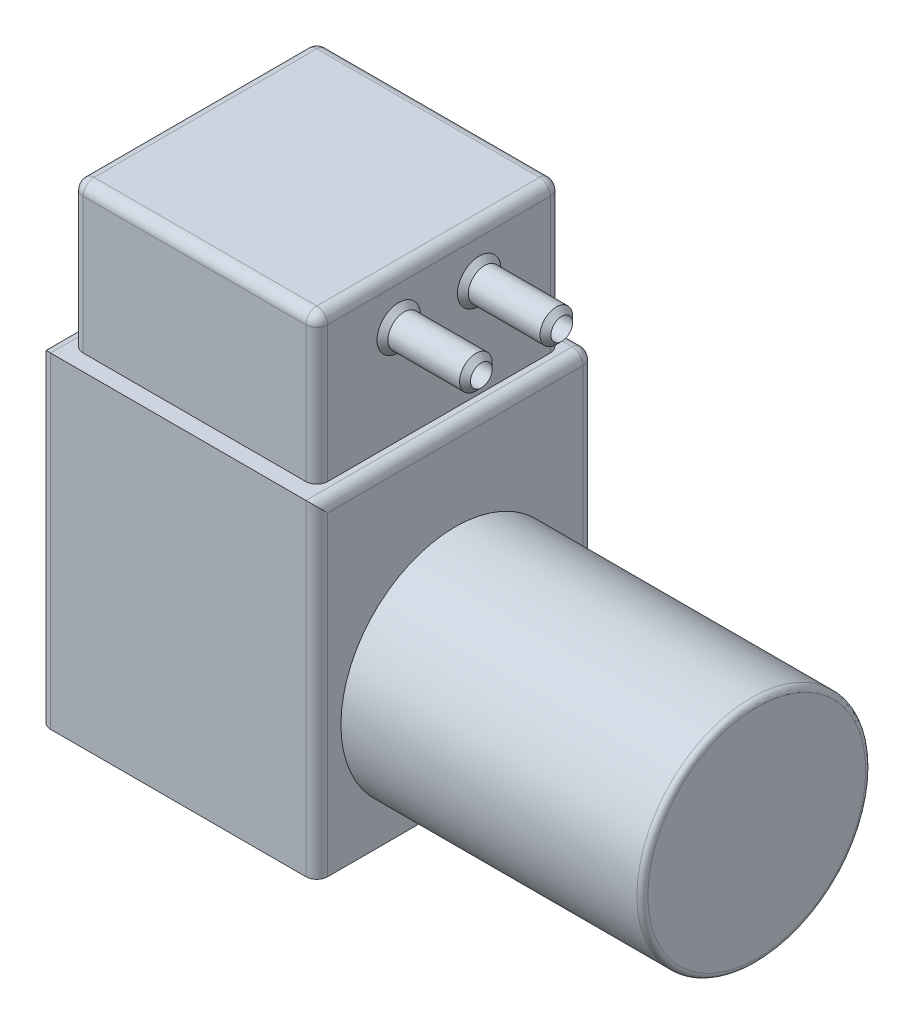
ISO-10303-21;
HEADER;
FILE_DESCRIPTION(('STEP AP214'),'2;1');
FILE_NAME('part.step','',(''),(''),'','','');
FILE_SCHEMA(('AUTOMOTIVE_DESIGN { 1 0 10303 214 1 1 1 1 }'));
ENDSEC;
DATA;
#1=APPLICATION_CONTEXT('core data for automotive mechanical design processes');
#2=APPLICATION_PROTOCOL_DEFINITION('international standard','automotive_design',2000,#1);
#3=PRODUCT_CONTEXT('',#1,'mechanical');
#4=PRODUCT('Part','Part','',(#3));
#5=PRODUCT_RELATED_PRODUCT_CATEGORY('part','',(#4));
#6=PRODUCT_DEFINITION_FORMATION('','',#4);
#7=PRODUCT_DEFINITION_CONTEXT('part definition',#1,'design');
#8=PRODUCT_DEFINITION('design','',#6,#7);
#9=PRODUCT_DEFINITION_SHAPE('','',#8);
#10=(LENGTH_UNIT() NAMED_UNIT(*) SI_UNIT(.MILLI.,.METRE.));
#11=(NAMED_UNIT(*) PLANE_ANGLE_UNIT() SI_UNIT($,.RADIAN.));
#12=(NAMED_UNIT(*) SI_UNIT($,.STERADIAN.) SOLID_ANGLE_UNIT());
#13=UNCERTAINTY_MEASURE_WITH_UNIT(LENGTH_MEASURE(1.E-05),#10,'distance_accuracy_value','');
#14=(GEOMETRIC_REPRESENTATION_CONTEXT(3) GLOBAL_UNCERTAINTY_ASSIGNED_CONTEXT((#13)) GLOBAL_UNIT_ASSIGNED_CONTEXT((#10,
#11,#12)) REPRESENTATION_CONTEXT('',''));
#15=CARTESIAN_POINT('',(0.,0.,0.));
#16=DIRECTION('',(0.,0.,1.));
#17=DIRECTION('',(1.,0.,0.));
#18=AXIS2_PLACEMENT_3D('',#15,#16,#17);
#19=CARTESIAN_POINT('',(48.,87.,-48.));
#20=DIRECTION('',(-1.,0.,0.));
#21=DIRECTION('',(0.,0.,1.));
#22=AXIS2_PLACEMENT_3D('',#19,#20,#21);
#23=PLANE('',#22);
#24=CARTESIAN_POINT('',(48.,78.,-18.1));
#25=DIRECTION('',(-1.,0.,0.));
#26=DIRECTION('',(0.,0.,1.));
#27=AXIS2_PLACEMENT_3D('',#24,#25,#26);
#28=CIRCLE('',#27,4.00000000000001);
#29=CARTESIAN_POINT('',(48.,78.,-14.1));
#30=VERTEX_POINT('',#29);
#31=EDGE_CURVE('E223',#30,#30,#28,.F.);
#32=ORIENTED_EDGE('',*,*,#31,.F.);
#33=EDGE_LOOP('',(#32));
#34=FACE_BOUND('',#33,.T.);
#35=DIRECTION('',(0.,0.,-1.));
#36=VECTOR('',#35,1.);
#37=CARTESIAN_POINT('',(48.,60.,-48.));
#38=LINE('',#37,#36);
#39=CARTESIAN_POINT('',(48.,60.,-5.00000000000001));
#40=VERTEX_POINT('',#39);
#41=CARTESIAN_POINT('',(48.,60.,-46.));
#42=VERTEX_POINT('',#41);
#43=EDGE_CURVE('E194',#40,#42,#38,.T.);
#44=ORIENTED_EDGE('',*,*,#43,.T.);
#45=DIRECTION('',(0.,-1.,0.));
#46=VECTOR('',#45,1.);
#47=CARTESIAN_POINT('',(48.,87.,-46.));
#48=LINE('',#47,#46);
#49=CARTESIAN_POINT('',(48.,85.,-46.));
#50=VERTEX_POINT('',#49);
#51=EDGE_CURVE('E257',#42,#50,#48,.F.);
#52=ORIENTED_EDGE('',*,*,#51,.T.);
#53=DIRECTION('',(0.,0.,-1.));
#54=VECTOR('',#53,1.);
#55=CARTESIAN_POINT('',(48.,85.,-3.));
#56=LINE('',#55,#54);
#57=CARTESIAN_POINT('',(48.,85.,-5.));
#58=VERTEX_POINT('',#57);
#59=EDGE_CURVE('E255',#50,#58,#56,.F.);
#60=ORIENTED_EDGE('',*,*,#59,.T.);
#61=DIRECTION('',(0.,-1.,0.));
#62=VECTOR('',#61,1.);
#63=CARTESIAN_POINT('',(48.,87.,-5.));
#64=LINE('',#63,#62);
#65=EDGE_CURVE('E253',#58,#40,#64,.T.);
#66=ORIENTED_EDGE('',*,*,#65,.T.);
#67=EDGE_LOOP('',(#44,#52,#60,#66));
#68=FACE_BOUND('',#67,.T.);
#69=CARTESIAN_POINT('',(48.,78.,-32.9));
#70=DIRECTION('',(-1.,0.,0.));
#71=DIRECTION('',(0.,0.,1.));
#72=AXIS2_PLACEMENT_3D('',#69,#70,#71);
#73=CIRCLE('',#72,4.00000000000001);
#74=CARTESIAN_POINT('',(48.,78.,-28.9));
#75=VERTEX_POINT('',#74);
#76=EDGE_CURVE('E226',#75,#75,#73,.F.);
#77=ORIENTED_EDGE('',*,*,#76,.F.);
#78=EDGE_LOOP('',(#77));
#79=FACE_BOUND('',#78,.T.);
#80=ADVANCED_FACE('F35',(#34,#68,#79),#23,.F.);
#81=CARTESIAN_POINT('',(51.,60.,0.));
#82=DIRECTION('',(-1.,0.,0.));
#83=DIRECTION('',(0.,0.,1.));
#84=AXIS2_PLACEMENT_3D('',#81,#82,#83);
#85=PLANE('',#84);
#86=DIRECTION('',(0.,0.,-1.));
#87=VECTOR('',#86,1.);
#88=CARTESIAN_POINT('',(51.,58.,0.));
#89=LINE('',#88,#87);
#90=CARTESIAN_POINT('',(51.,58.,-49.));
#91=VERTEX_POINT('',#90);
#92=CARTESIAN_POINT('',(51.,58.,-2.));
#93=VERTEX_POINT('',#92);
#94=EDGE_CURVE('E271',#91,#93,#89,.F.);
#95=ORIENTED_EDGE('',*,*,#94,.T.);
#96=DIRECTION('',(0.,-1.,0.));
#97=VECTOR('',#96,1.);
#98=CARTESIAN_POINT('',(51.,60.,-2.));
#99=LINE('',#98,#97);
#100=CARTESIAN_POINT('',(51.,0.,-2.));
#101=VERTEX_POINT('',#100);
#102=EDGE_CURVE('E312',#93,#101,#99,.T.);
#103=ORIENTED_EDGE('',*,*,#102,.T.);
#104=DIRECTION('',(0.,0.,-1.));
#105=VECTOR('',#104,1.);
#106=CARTESIAN_POINT('',(51.,0.,0.));
#107=LINE('',#106,#105);
#108=CARTESIAN_POINT('',(51.,0.,-49.));
#109=VERTEX_POINT('',#108);
#110=EDGE_CURVE('E217',#101,#109,#107,.T.);
#111=ORIENTED_EDGE('',*,*,#110,.T.);
#112=DIRECTION('',(0.,-1.,0.));
#113=VECTOR('',#112,1.);
#114=CARTESIAN_POINT('',(51.,60.,-49.));
#115=LINE('',#114,#113);
#116=EDGE_CURVE('E310',#109,#91,#115,.F.);
#117=ORIENTED_EDGE('',*,*,#116,.T.);
#118=EDGE_LOOP('',(#95,#103,#111,#117));
#119=FACE_BOUND('',#118,.T.);
#120=CARTESIAN_POINT('',(51.,23.,-25.5));
#121=DIRECTION('',(-1.,0.,0.));
#122=DIRECTION('',(0.,0.,1.));
#123=AXIS2_PLACEMENT_3D('',#120,#121,#122);
#124=CIRCLE('',#123,21.05);
#125=CARTESIAN_POINT('',(51.,23.,-4.45000000000001));
#126=VERTEX_POINT('',#125);
#127=EDGE_CURVE('E210',#126,#126,#124,.F.);
#128=ORIENTED_EDGE('',*,*,#127,.F.);
#129=EDGE_LOOP('',(#128));
#130=FACE_BOUND('',#129,.T.);
#131=ADVANCED_FACE('F381',(#119,#130),#85,.F.);
#132=CARTESIAN_POINT('',(0.,60.,-51.));
#133=DIRECTION('',(0.,-1.,0.));
#134=DIRECTION('',(0.,0.,-1.));
#135=AXIS2_PLACEMENT_3D('',#132,#133,#134);
#136=PLANE('',#135);
#137=DIRECTION('',(-1.,0.,0.));
#138=VECTOR('',#137,1.);
#139=CARTESIAN_POINT('',(0.,60.,-49.));
#140=LINE('',#139,#138);
#141=CARTESIAN_POINT('',(49.,60.,-49.));
#142=VERTEX_POINT('',#141);
#143=CARTESIAN_POINT('',(2.,60.,-49.));
#144=VERTEX_POINT('',#143);
#145=EDGE_CURVE('E335',#142,#144,#140,.T.);
#146=ORIENTED_EDGE('',*,*,#145,.T.);
#147=DIRECTION('',(0.,0.,1.));
#148=VECTOR('',#147,1.);
#149=CARTESIAN_POINT('',(2.,60.,-51.));
#150=LINE('',#149,#148);
#151=CARTESIAN_POINT('',(2.,60.,0.));
#152=VERTEX_POINT('',#151);
#153=EDGE_CURVE('E337',#144,#152,#150,.T.);
#154=ORIENTED_EDGE('',*,*,#153,.T.);
#155=DIRECTION('',(1.,0.,0.));
#156=VECTOR('',#155,1.);
#157=CARTESIAN_POINT('',(0.,60.,0.));
#158=LINE('',#157,#156);
#159=CARTESIAN_POINT('',(49.,60.,0.));
#160=VERTEX_POINT('',#159);
#161=EDGE_CURVE('E207',#152,#160,#158,.T.);
#162=ORIENTED_EDGE('',*,*,#161,.T.);
#163=DIRECTION('',(0.,0.,-1.));
#164=VECTOR('',#163,1.);
#165=CARTESIAN_POINT('',(49.,60.,-51.));
#166=LINE('',#165,#164);
#167=EDGE_CURVE('E333',#160,#142,#166,.T.);
#168=ORIENTED_EDGE('',*,*,#167,.T.);
#169=EDGE_LOOP('',(#146,#154,#162,#168));
#170=FACE_BOUND('',#169,.T.);
#171=DIRECTION('',(0.,0.,1.));
#172=VECTOR('',#171,1.);
#173=CARTESIAN_POINT('',(3.,60.,-48.));
#174=LINE('',#173,#172);
#175=CARTESIAN_POINT('',(3.,60.,-46.));
#176=VERTEX_POINT('',#175);
#177=CARTESIAN_POINT('',(3.00000000000001,60.,-5.00000000000001));
#178=VERTEX_POINT('',#177);
#179=EDGE_CURVE('E195',#176,#178,#174,.T.);
#180=ORIENTED_EDGE('',*,*,#179,.F.);
#181=CARTESIAN_POINT('',(5.,60.,-46.));
#182=DIRECTION('',(0.,-1.,0.));
#183=DIRECTION('',(0.,0.,-1.));
#184=AXIS2_PLACEMENT_3D('',#181,#182,#183);
#185=CIRCLE('',#184,2.);
#186=CARTESIAN_POINT('',(5.,60.,-48.));
#187=VERTEX_POINT('',#186);
#188=EDGE_CURVE('E176',#176,#187,#185,.T.);
#189=ORIENTED_EDGE('',*,*,#188,.T.);
#190=DIRECTION('',(-1.,0.,0.));
#191=VECTOR('',#190,1.);
#192=CARTESIAN_POINT('',(3.,60.,-48.));
#193=LINE('',#192,#191);
#194=CARTESIAN_POINT('',(46.,60.,-48.));
#195=VERTEX_POINT('',#194);
#196=EDGE_CURVE('E198',#195,#187,#193,.T.);
#197=ORIENTED_EDGE('',*,*,#196,.F.);
#198=CARTESIAN_POINT('',(46.,60.,-46.));
#199=DIRECTION('',(0.,-1.,0.));
#200=DIRECTION('',(0.,0.,-1.));
#201=AXIS2_PLACEMENT_3D('',#198,#199,#200);
#202=CIRCLE('',#201,2.);
#203=EDGE_CURVE('E268',#195,#42,#202,.T.);
#204=ORIENTED_EDGE('',*,*,#203,.T.);
#205=ORIENTED_EDGE('',*,*,#43,.F.);
#206=CARTESIAN_POINT('',(46.,60.,-5.));
#207=DIRECTION('',(0.,-1.,0.));
#208=DIRECTION('',(0.,0.,-1.));
#209=AXIS2_PLACEMENT_3D('',#206,#207,#208);
#210=CIRCLE('',#209,2.);
#211=CARTESIAN_POINT('',(46.,60.,-3.));
#212=VERTEX_POINT('',#211);
#213=EDGE_CURVE('E193',#40,#212,#210,.T.);
#214=ORIENTED_EDGE('',*,*,#213,.T.);
#215=DIRECTION('',(1.,0.,0.));
#216=VECTOR('',#215,1.);
#217=CARTESIAN_POINT('',(3.00000000000001,60.,-3.));
#218=LINE('',#217,#216);
#219=CARTESIAN_POINT('',(5.,60.,-3.));
#220=VERTEX_POINT('',#219);
#221=EDGE_CURVE('E182',#220,#212,#218,.T.);
#222=ORIENTED_EDGE('',*,*,#221,.F.);
#223=CARTESIAN_POINT('',(5.00000000000001,60.,-5.));
#224=DIRECTION('',(0.,-1.,0.));
#225=DIRECTION('',(0.,0.,-1.));
#226=AXIS2_PLACEMENT_3D('',#223,#224,#225);
#227=CIRCLE('',#226,2.);
#228=EDGE_CURVE('E166',#220,#178,#227,.T.);
#229=ORIENTED_EDGE('',*,*,#228,.T.);
#230=EDGE_LOOP('',(#180,#189,#197,#204,#205,#214,#222,#229));
#231=FACE_BOUND('',#230,.T.);
#232=ADVANCED_FACE('F190',(#170,#231),#136,.F.);
#233=CARTESIAN_POINT('',(0.,60.,0.));
#234=DIRECTION('',(1.,0.,0.));
#235=DIRECTION('',(0.,0.,-1.));
#236=AXIS2_PLACEMENT_3D('',#233,#234,#235);
#237=PLANE('',#236);
#238=DIRECTION('',(0.,0.,1.));
#239=VECTOR('',#238,1.);
#240=CARTESIAN_POINT('',(0.,0.,0.));
#241=LINE('',#240,#239);
#242=CARTESIAN_POINT('',(0.,0.,-49.));
#243=VERTEX_POINT('',#242);
#244=CARTESIAN_POINT('',(0.,0.,-2.));
#245=VERTEX_POINT('',#244);
#246=EDGE_CURVE('E206',#243,#245,#241,.T.);
#247=ORIENTED_EDGE('',*,*,#246,.T.);
#248=DIRECTION('',(0.,-1.,0.));
#249=VECTOR('',#248,1.);
#250=CARTESIAN_POINT('',(0.,60.,-2.));
#251=LINE('',#250,#249);
#252=CARTESIAN_POINT('',(0.,58.,-2.));
#253=VERTEX_POINT('',#252);
#254=EDGE_CURVE('E331',#245,#253,#251,.F.);
#255=ORIENTED_EDGE('',*,*,#254,.T.);
#256=DIRECTION('',(0.,0.,1.));
#257=VECTOR('',#256,1.);
#258=CARTESIAN_POINT('',(0.,58.,0.));
#259=LINE('',#258,#257);
#260=CARTESIAN_POINT('',(0.,58.,-49.));
#261=VERTEX_POINT('',#260);
#262=EDGE_CURVE('E329',#253,#261,#259,.F.);
#263=ORIENTED_EDGE('',*,*,#262,.T.);
#264=DIRECTION('',(0.,-1.,0.));
#265=VECTOR('',#264,1.);
#266=CARTESIAN_POINT('',(0.,60.,-49.));
#267=LINE('',#266,#265);
#268=EDGE_CURVE('E327',#261,#243,#267,.T.);
#269=ORIENTED_EDGE('',*,*,#268,.T.);
#270=EDGE_LOOP('',(#247,#255,#263,#269));
#271=FACE_BOUND('',#270,.T.);
#272=ADVANCED_FACE('F404',(#271),#237,.F.);
#273=CARTESIAN_POINT('',(0.,60.,0.));
#274=DIRECTION('',(0.,0.,-1.));
#275=DIRECTION('',(-1.,0.,0.));
#276=AXIS2_PLACEMENT_3D('',#273,#274,#275);
#277=PLANE('',#276);
#278=DIRECTION('',(1.,0.,0.));
#279=VECTOR('',#278,1.);
#280=CARTESIAN_POINT('',(0.,0.,0.));
#281=LINE('',#280,#279);
#282=CARTESIAN_POINT('',(2.,0.,0.));
#283=VERTEX_POINT('',#282);
#284=CARTESIAN_POINT('',(49.,0.,0.));
#285=VERTEX_POINT('',#284);
#286=EDGE_CURVE('E214',#283,#285,#281,.T.);
#287=ORIENTED_EDGE('',*,*,#286,.T.);
#288=DIRECTION('',(0.,-1.,0.));
#289=VECTOR('',#288,1.);
#290=CARTESIAN_POINT('',(49.,60.,0.));
#291=LINE('',#290,#289);
#292=EDGE_CURVE('E325',#285,#160,#291,.F.);
#293=ORIENTED_EDGE('',*,*,#292,.T.);
#294=ORIENTED_EDGE('',*,*,#161,.F.);
#295=DIRECTION('',(0.,-1.,0.));
#296=VECTOR('',#295,1.);
#297=CARTESIAN_POINT('',(2.,60.,0.));
#298=LINE('',#297,#296);
#299=EDGE_CURVE('E323',#152,#283,#298,.T.);
#300=ORIENTED_EDGE('',*,*,#299,.T.);
#301=EDGE_LOOP('',(#287,#293,#294,#300));
#302=FACE_BOUND('',#301,.T.);
#303=ADVANCED_FACE('F411',(#302),#277,.F.);
#304=CARTESIAN_POINT('',(0.,60.,-51.));
#305=DIRECTION('',(0.,0.,1.));
#306=DIRECTION('',(1.,0.,0.));
#307=AXIS2_PLACEMENT_3D('',#304,#305,#306);
#308=PLANE('',#307);
#309=DIRECTION('',(-1.,0.,0.));
#310=VECTOR('',#309,1.);
#311=CARTESIAN_POINT('',(0.,0.,-51.));
#312=LINE('',#311,#310);
#313=CARTESIAN_POINT('',(49.,0.,-51.));
#314=VERTEX_POINT('',#313);
#315=CARTESIAN_POINT('',(2.,0.,-51.));
#316=VERTEX_POINT('',#315);
#317=EDGE_CURVE('E211',#314,#316,#312,.T.);
#318=ORIENTED_EDGE('',*,*,#317,.T.);
#319=DIRECTION('',(0.,-1.,0.));
#320=VECTOR('',#319,1.);
#321=CARTESIAN_POINT('',(2.,60.,-51.));
#322=LINE('',#321,#320);
#323=CARTESIAN_POINT('',(2.,58.,-51.));
#324=VERTEX_POINT('',#323);
#325=EDGE_CURVE('E50',#316,#324,#322,.F.);
#326=ORIENTED_EDGE('',*,*,#325,.T.);
#327=DIRECTION('',(-1.,0.,0.));
#328=VECTOR('',#327,1.);
#329=CARTESIAN_POINT('',(0.,58.,-51.));
#330=LINE('',#329,#328);
#331=CARTESIAN_POINT('',(49.,58.,-51.));
#332=VERTEX_POINT('',#331);
#333=EDGE_CURVE('E55',#324,#332,#330,.F.);
#334=ORIENTED_EDGE('',*,*,#333,.T.);
#335=DIRECTION('',(0.,-1.,0.));
#336=VECTOR('',#335,1.);
#337=CARTESIAN_POINT('',(49.,60.,-51.));
#338=LINE('',#337,#336);
#339=EDGE_CURVE('E339',#332,#314,#338,.T.);
#340=ORIENTED_EDGE('',*,*,#339,.T.);
#341=EDGE_LOOP('',(#318,#326,#334,#340));
#342=FACE_BOUND('',#341,.T.);
#343=ADVANCED_FACE('F408',(#342),#308,.F.);
#344=CARTESIAN_POINT('',(0.,0.,-51.));
#345=DIRECTION('',(0.,-1.,0.));
#346=DIRECTION('',(0.,0.,-1.));
#347=AXIS2_PLACEMENT_3D('',#344,#345,#346);
#348=PLANE('',#347);
#349=ORIENTED_EDGE('',*,*,#110,.F.);
#350=CARTESIAN_POINT('',(49.,0.,-2.));
#351=DIRECTION('',(0.,-1.,0.));
#352=DIRECTION('',(0.,0.,-1.));
#353=AXIS2_PLACEMENT_3D('',#350,#351,#352);
#354=CIRCLE('',#353,2.);
#355=EDGE_CURVE('E321',#101,#285,#354,.T.);
#356=ORIENTED_EDGE('',*,*,#355,.T.);
#357=ORIENTED_EDGE('',*,*,#286,.F.);
#358=CARTESIAN_POINT('',(2.,0.,-2.));
#359=DIRECTION('',(0.,-1.,0.));
#360=DIRECTION('',(0.,0.,-1.));
#361=AXIS2_PLACEMENT_3D('',#358,#359,#360);
#362=CIRCLE('',#361,2.);
#363=EDGE_CURVE('E319',#283,#245,#362,.T.);
#364=ORIENTED_EDGE('',*,*,#363,.T.);
#365=ORIENTED_EDGE('',*,*,#246,.F.);
#366=CARTESIAN_POINT('',(2.,0.,-49.));
#367=DIRECTION('',(0.,-1.,0.));
#368=DIRECTION('',(0.,0.,-1.));
#369=AXIS2_PLACEMENT_3D('',#366,#367,#368);
#370=CIRCLE('',#369,2.);
#371=EDGE_CURVE('E317',#243,#316,#370,.T.);
#372=ORIENTED_EDGE('',*,*,#371,.T.);
#373=ORIENTED_EDGE('',*,*,#317,.F.);
#374=CARTESIAN_POINT('',(49.,0.,-49.));
#375=DIRECTION('',(0.,-1.,0.));
#376=DIRECTION('',(0.,0.,-1.));
#377=AXIS2_PLACEMENT_3D('',#374,#375,#376);
#378=CIRCLE('',#377,2.);
#379=EDGE_CURVE('E315',#314,#109,#378,.T.);
#380=ORIENTED_EDGE('',*,*,#379,.T.);
#381=EDGE_LOOP('',(#349,#356,#357,#364,#365,#372,#373,#380));
#382=FACE_BOUND('',#381,.T.);
#383=ADVANCED_FACE('F400',(#382),#348,.T.);
#384=CARTESIAN_POINT('',(3.,87.,-48.));
#385=DIRECTION('',(1.,0.,0.));
#386=DIRECTION('',(0.,0.,-1.));
#387=AXIS2_PLACEMENT_3D('',#384,#385,#386);
#388=PLANE('',#387);
#389=ORIENTED_EDGE('',*,*,#179,.T.);
#390=DIRECTION('',(0.,-1.,0.));
#391=VECTOR('',#390,1.);
#392=CARTESIAN_POINT('',(3.00000000000001,87.,-5.));
#393=LINE('',#392,#391);
#394=CARTESIAN_POINT('',(3.00000000000001,85.,-5.));
#395=VERTEX_POINT('',#394);
#396=EDGE_CURVE('E171',#178,#395,#393,.F.);
#397=ORIENTED_EDGE('',*,*,#396,.T.);
#398=DIRECTION('',(0.,0.,1.));
#399=VECTOR('',#398,1.);
#400=CARTESIAN_POINT('',(3.,85.,-48.));
#401=LINE('',#400,#399);
#402=CARTESIAN_POINT('',(3.,85.,-46.));
#403=VERTEX_POINT('',#402);
#404=EDGE_CURVE('E187',#395,#403,#401,.F.);
#405=ORIENTED_EDGE('',*,*,#404,.T.);
#406=DIRECTION('',(0.,-1.,0.));
#407=VECTOR('',#406,1.);
#408=CARTESIAN_POINT('',(3.,87.,-46.));
#409=LINE('',#408,#407);
#410=EDGE_CURVE('E244',#403,#176,#409,.T.);
#411=ORIENTED_EDGE('',*,*,#410,.T.);
#412=EDGE_LOOP('',(#389,#397,#405,#411));
#413=FACE_BOUND('',#412,.T.);
#414=ADVANCED_FACE('F397',(#413),#388,.F.);
#415=CARTESIAN_POINT('',(3.00000000000001,87.,-3.));
#416=DIRECTION('',(0.,0.,-1.));
#417=DIRECTION('',(-1.,0.,0.));
#418=AXIS2_PLACEMENT_3D('',#415,#416,#417);
#419=PLANE('',#418);
#420=DIRECTION('',(1.,0.,0.));
#421=VECTOR('',#420,1.);
#422=CARTESIAN_POINT('',(3.00000000000001,85.,-3.));
#423=LINE('',#422,#421);
#424=CARTESIAN_POINT('',(46.,85.,-3.));
#425=VERTEX_POINT('',#424);
#426=CARTESIAN_POINT('',(5.00000000000001,85.,-3.));
#427=VERTEX_POINT('',#426);
#428=EDGE_CURVE('E185',#425,#427,#423,.F.);
#429=ORIENTED_EDGE('',*,*,#428,.T.);
#430=DIRECTION('',(0.,-1.,0.));
#431=VECTOR('',#430,1.);
#432=CARTESIAN_POINT('',(5.00000000000001,87.,-3.));
#433=LINE('',#432,#431);
#434=EDGE_CURVE('E170',#427,#220,#433,.T.);
#435=ORIENTED_EDGE('',*,*,#434,.T.);
#436=ORIENTED_EDGE('',*,*,#221,.T.);
#437=DIRECTION('',(0.,-1.,0.));
#438=VECTOR('',#437,1.);
#439=CARTESIAN_POINT('',(46.,87.,-3.));
#440=LINE('',#439,#438);
#441=EDGE_CURVE('E188',#212,#425,#440,.F.);
#442=ORIENTED_EDGE('',*,*,#441,.T.);
#443=EDGE_LOOP('',(#429,#435,#436,#442));
#444=FACE_BOUND('',#443,.T.);
#445=ADVANCED_FACE('F181',(#444),#419,.F.);
#446=CARTESIAN_POINT('',(3.,87.,-48.));
#447=DIRECTION('',(0.,0.,1.));
#448=DIRECTION('',(1.,0.,0.));
#449=AXIS2_PLACEMENT_3D('',#446,#447,#448);
#450=PLANE('',#449);
#451=ORIENTED_EDGE('',*,*,#196,.T.);
#452=DIRECTION('',(0.,-1.,0.));
#453=VECTOR('',#452,1.);
#454=CARTESIAN_POINT('',(5.,87.,-48.));
#455=LINE('',#454,#453);
#456=CARTESIAN_POINT('',(5.,85.,-48.));
#457=VERTEX_POINT('',#456);
#458=EDGE_CURVE('E251',#187,#457,#455,.F.);
#459=ORIENTED_EDGE('',*,*,#458,.T.);
#460=DIRECTION('',(-1.,0.,0.));
#461=VECTOR('',#460,1.);
#462=CARTESIAN_POINT('',(48.,85.,-48.));
#463=LINE('',#462,#461);
#464=CARTESIAN_POINT('',(46.,85.,-48.));
#465=VERTEX_POINT('',#464);
#466=EDGE_CURVE('E247',#457,#465,#463,.F.);
#467=ORIENTED_EDGE('',*,*,#466,.T.);
#468=DIRECTION('',(0.,-1.,0.));
#469=VECTOR('',#468,1.);
#470=CARTESIAN_POINT('',(46.,87.,-48.));
#471=LINE('',#470,#469);
#472=EDGE_CURVE('E249',#465,#195,#471,.T.);
#473=ORIENTED_EDGE('',*,*,#472,.T.);
#474=EDGE_LOOP('',(#451,#459,#467,#473));
#475=FACE_BOUND('',#474,.T.);
#476=ADVANCED_FACE('F393',(#475),#450,.F.);
#477=CARTESIAN_POINT('',(3.00000000000001,87.,-3.));
#478=DIRECTION('',(0.,1.,0.));
#479=DIRECTION('',(0.,0.,1.));
#480=AXIS2_PLACEMENT_3D('',#477,#478,#479);
#481=PLANE('',#480);
#482=DIRECTION('',(0.,0.,-1.));
#483=VECTOR('',#482,1.);
#484=CARTESIAN_POINT('',(46.,87.,-48.));
#485=LINE('',#484,#483);
#486=CARTESIAN_POINT('',(46.,87.,-5.));
#487=VERTEX_POINT('',#486);
#488=CARTESIAN_POINT('',(46.,87.,-46.));
#489=VERTEX_POINT('',#488);
#490=EDGE_CURVE('E261',#487,#489,#485,.T.);
#491=ORIENTED_EDGE('',*,*,#490,.T.);
#492=DIRECTION('',(-1.,0.,0.));
#493=VECTOR('',#492,1.);
#494=CARTESIAN_POINT('',(3.,87.,-46.));
#495=LINE('',#494,#493);
#496=CARTESIAN_POINT('',(5.,87.,-46.));
#497=VERTEX_POINT('',#496);
#498=EDGE_CURVE('E177',#489,#497,#495,.T.);
#499=ORIENTED_EDGE('',*,*,#498,.T.);
#500=DIRECTION('',(0.,0.,1.));
#501=VECTOR('',#500,1.);
#502=CARTESIAN_POINT('',(5.00000000000001,87.,-3.));
#503=LINE('',#502,#501);
#504=CARTESIAN_POINT('',(5.00000000000001,87.,-5.));
#505=VERTEX_POINT('',#504);
#506=EDGE_CURVE('E263',#497,#505,#503,.T.);
#507=ORIENTED_EDGE('',*,*,#506,.T.);
#508=DIRECTION('',(1.,0.,0.));
#509=VECTOR('',#508,1.);
#510=CARTESIAN_POINT('',(48.,87.,-5.));
#511=LINE('',#510,#509);
#512=EDGE_CURVE('E259',#505,#487,#511,.T.);
#513=ORIENTED_EDGE('',*,*,#512,.T.);
#514=EDGE_LOOP('',(#491,#499,#507,#513));
#515=FACE_BOUND('',#514,.T.);
#516=ADVANCED_FACE('F544',(#515),#481,.T.);
#517=CARTESIAN_POINT('',(106.5,23.,-25.5));
#518=DIRECTION('',(-1.,0.,0.));
#519=DIRECTION('',(0.,0.,1.));
#520=AXIS2_PLACEMENT_3D('',#517,#518,#519);
#521=CYLINDRICAL_SURFACE('',#520,21.05);
#522=CARTESIAN_POINT('',(105.5,23.,-25.5));
#523=DIRECTION('',(1.,0.,0.));
#524=DIRECTION('',(0.,0.,-1.));
#525=AXIS2_PLACEMENT_3D('',#522,#523,#524);
#526=CIRCLE('',#525,21.05);
#527=CARTESIAN_POINT('',(105.5,23.,-46.55));
#528=VERTEX_POINT('',#527);
#529=EDGE_CURVE('E11',#528,#528,#526,.F.);
#530=ORIENTED_EDGE('',*,*,#529,.T.);
#531=EDGE_LOOP('',(#530));
#532=FACE_BOUND('',#531,.T.);
#533=ORIENTED_EDGE('',*,*,#127,.T.);
#534=EDGE_LOOP('',(#533));
#535=FACE_BOUND('',#534,.T.);
#536=ADVANCED_FACE('F542',(#532,#535),#521,.T.);
#537=CARTESIAN_POINT('',(106.5,23.,-25.5));
#538=DIRECTION('',(1.,0.,0.));
#539=DIRECTION('',(0.,0.,-1.));
#540=AXIS2_PLACEMENT_3D('',#537,#538,#539);
#541=PLANE('',#540);
#542=CARTESIAN_POINT('',(106.5,23.,-25.5));
#543=DIRECTION('',(1.,0.,0.));
#544=DIRECTION('',(0.,0.,-1.));
#545=AXIS2_PLACEMENT_3D('',#542,#543,#544);
#546=CIRCLE('',#545,20.05);
#547=CARTESIAN_POINT('',(106.5,23.,-45.55));
#548=VERTEX_POINT('',#547);
#549=EDGE_CURVE('E43',#548,#548,#546,.T.);
#550=ORIENTED_EDGE('',*,*,#549,.T.);
#551=EDGE_LOOP('',(#550));
#552=FACE_BOUND('',#551,.T.);
#553=ADVANCED_FACE('F368',(#552),#541,.T.);
#554=CARTESIAN_POINT('',(63.2,78.,-18.1));
#555=DIRECTION('',(-1.,0.,0.));
#556=DIRECTION('',(0.,0.,1.));
#557=AXIS2_PLACEMENT_3D('',#554,#555,#556);
#558=CYLINDRICAL_SURFACE('',#557,3.);
#559=CARTESIAN_POINT('',(62.2,78.,-18.1));
#560=DIRECTION('',(1.,0.,0.));
#561=DIRECTION('',(0.,0.,-1.));
#562=AXIS2_PLACEMENT_3D('',#559,#560,#561);
#563=CIRCLE('',#562,3.);
#564=CARTESIAN_POINT('',(62.2,78.,-21.1));
#565=VERTEX_POINT('',#564);
#566=EDGE_CURVE('E238',#565,#565,#563,.F.);
#567=ORIENTED_EDGE('',*,*,#566,.T.);
#568=EDGE_LOOP('',(#567));
#569=FACE_BOUND('',#568,.T.);
#570=CARTESIAN_POINT('',(49.,78.,-18.1));
#571=DIRECTION('',(1.,0.,0.));
#572=DIRECTION('',(0.,0.,-1.));
#573=AXIS2_PLACEMENT_3D('',#570,#571,#572);
#574=CIRCLE('',#573,3.);
#575=CARTESIAN_POINT('',(49.,78.,-21.1));
#576=VERTEX_POINT('',#575);
#577=EDGE_CURVE('E200',#576,#576,#574,.T.);
#578=ORIENTED_EDGE('',*,*,#577,.T.);
#579=EDGE_LOOP('',(#578));
#580=FACE_BOUND('',#579,.T.);
#581=ADVANCED_FACE('F551',(#569,#580),#558,.T.);
#582=CARTESIAN_POINT('',(63.2,78.,-18.1));
#583=DIRECTION('',(-1.,0.,0.));
#584=DIRECTION('',(0.,0.,1.));
#585=AXIS2_PLACEMENT_3D('',#582,#583,#584);
#586=CYLINDRICAL_SURFACE('',#585,2.);
#587=CARTESIAN_POINT('',(63.2,78.,-18.1));
#588=DIRECTION('',(1.,0.,0.));
#589=DIRECTION('',(0.,0.,-1.));
#590=AXIS2_PLACEMENT_3D('',#587,#588,#589);
#591=CIRCLE('',#590,2.);
#592=CARTESIAN_POINT('',(63.2,78.,-20.1));
#593=VERTEX_POINT('',#592);
#594=EDGE_CURVE('E586',#593,#593,#591,.T.);
#595=ORIENTED_EDGE('',*,*,#594,.T.);
#596=EDGE_LOOP('',(#595));
#597=FACE_BOUND('',#596,.T.);
#598=CARTESIAN_POINT('',(49.,78.,-18.1));
#599=DIRECTION('',(1.,0.,0.));
#600=DIRECTION('',(0.,0.,-1.));
#601=AXIS2_PLACEMENT_3D('',#598,#599,#600);
#602=CIRCLE('',#601,2.);
#603=CARTESIAN_POINT('',(49.,78.,-20.1));
#604=VERTEX_POINT('',#603);
#605=EDGE_CURVE('E229',#604,#604,#602,.F.);
#606=ORIENTED_EDGE('',*,*,#605,.T.);
#607=EDGE_LOOP('',(#606));
#608=FACE_BOUND('',#607,.T.);
#609=ADVANCED_FACE('F559',(#597,#608),#586,.F.);
#610=CARTESIAN_POINT('',(49.,78.,-18.1));
#611=DIRECTION('',(1.,0.,0.));
#612=DIRECTION('',(0.,0.,-1.));
#613=AXIS2_PLACEMENT_3D('',#610,#611,#612);
#614=PLANE('',#613);
#615=ORIENTED_EDGE('',*,*,#605,.F.);
#616=EDGE_LOOP('',(#615));
#617=FACE_BOUND('',#616,.T.);
#618=ADVANCED_FACE('F555',(#617),#614,.T.);
#619=CARTESIAN_POINT('',(63.2,78.,-32.9));
#620=DIRECTION('',(-1.,0.,0.));
#621=DIRECTION('',(0.,0.,1.));
#622=AXIS2_PLACEMENT_3D('',#619,#620,#621);
#623=CYLINDRICAL_SURFACE('',#622,3.);
#624=CARTESIAN_POINT('',(62.2,78.,-32.9));
#625=DIRECTION('',(1.,0.,0.));
#626=DIRECTION('',(0.,0.,-1.));
#627=AXIS2_PLACEMENT_3D('',#624,#625,#626);
#628=CIRCLE('',#627,3.);
#629=CARTESIAN_POINT('',(62.2,78.,-35.9));
#630=VERTEX_POINT('',#629);
#631=EDGE_CURVE('E235',#630,#630,#628,.F.);
#632=ORIENTED_EDGE('',*,*,#631,.T.);
#633=EDGE_LOOP('',(#632));
#634=FACE_BOUND('',#633,.T.);
#635=CARTESIAN_POINT('',(49.,78.,-32.9));
#636=DIRECTION('',(1.,0.,0.));
#637=DIRECTION('',(0.,0.,-1.));
#638=AXIS2_PLACEMENT_3D('',#635,#636,#637);
#639=CIRCLE('',#638,3.);
#640=CARTESIAN_POINT('',(49.,78.,-35.9));
#641=VERTEX_POINT('',#640);
#642=EDGE_CURVE('E583',#641,#641,#639,.T.);
#643=ORIENTED_EDGE('',*,*,#642,.T.);
#644=EDGE_LOOP('',(#643));
#645=FACE_BOUND('',#644,.T.);
#646=ADVANCED_FACE('F558',(#634,#645),#623,.T.);
#647=CARTESIAN_POINT('',(63.2,78.,-32.9));
#648=DIRECTION('',(-1.,0.,0.));
#649=DIRECTION('',(0.,0.,1.));
#650=AXIS2_PLACEMENT_3D('',#647,#648,#649);
#651=CYLINDRICAL_SURFACE('',#650,2.);
#652=CARTESIAN_POINT('',(63.2,78.,-32.9));
#653=DIRECTION('',(1.,0.,0.));
#654=DIRECTION('',(0.,0.,-1.));
#655=AXIS2_PLACEMENT_3D('',#652,#653,#654);
#656=CIRCLE('',#655,2.);
#657=CARTESIAN_POINT('',(63.2,78.,-34.9));
#658=VERTEX_POINT('',#657);
#659=EDGE_CURVE('E308',#658,#658,#656,.T.);
#660=ORIENTED_EDGE('',*,*,#659,.T.);
#661=EDGE_LOOP('',(#660));
#662=FACE_BOUND('',#661,.T.);
#663=CARTESIAN_POINT('',(49.,78.,-32.9));
#664=DIRECTION('',(1.,0.,0.));
#665=DIRECTION('',(0.,0.,-1.));
#666=AXIS2_PLACEMENT_3D('',#663,#664,#665);
#667=CIRCLE('',#666,2.);
#668=CARTESIAN_POINT('',(49.,78.,-34.9));
#669=VERTEX_POINT('',#668);
#670=EDGE_CURVE('E232',#669,#669,#667,.F.);
#671=ORIENTED_EDGE('',*,*,#670,.T.);
#672=EDGE_LOOP('',(#671));
#673=FACE_BOUND('',#672,.T.);
#674=ADVANCED_FACE('F563',(#662,#673),#651,.F.);
#675=CARTESIAN_POINT('',(49.,78.,-32.9));
#676=DIRECTION('',(1.,0.,0.));
#677=DIRECTION('',(0.,0.,-1.));
#678=AXIS2_PLACEMENT_3D('',#675,#676,#677);
#679=PLANE('',#678);
#680=ORIENTED_EDGE('',*,*,#670,.F.);
#681=EDGE_LOOP('',(#680));
#682=FACE_BOUND('',#681,.T.);
#683=ADVANCED_FACE('F423',(#682),#679,.T.);
#684=CARTESIAN_POINT('',(63.2,78.,-32.9));
#685=DIRECTION('',(-1.,0.,0.));
#686=DIRECTION('',(0.,0.,1.));
#687=AXIS2_PLACEMENT_3D('',#684,#685,#686);
#688=CONICAL_SURFACE('',#687,1.99999999999997,0.785398163397444);
#689=ORIENTED_EDGE('',*,*,#631,.F.);
#690=EDGE_LOOP('',(#689));
#691=FACE_BOUND('',#690,.T.);
#692=ORIENTED_EDGE('',*,*,#659,.F.);
#693=EDGE_LOOP('',(#692));
#694=FACE_BOUND('',#693,.T.);
#695=ADVANCED_FACE('F419',(#691,#694),#688,.T.);
#696=CARTESIAN_POINT('',(49.,78.,-32.9));
#697=DIRECTION('',(-1.,0.,0.));
#698=DIRECTION('',(0.,0.,1.));
#699=AXIS2_PLACEMENT_3D('',#696,#697,#698);
#700=CONICAL_SURFACE('',#699,3.,0.78539816339745);
#701=ORIENTED_EDGE('',*,*,#76,.T.);
#702=EDGE_LOOP('',(#701));
#703=FACE_BOUND('',#702,.T.);
#704=ORIENTED_EDGE('',*,*,#642,.F.);
#705=EDGE_LOOP('',(#704));
#706=FACE_BOUND('',#705,.T.);
#707=ADVANCED_FACE('F422',(#703,#706),#700,.T.);
#708=CARTESIAN_POINT('',(63.2,78.,-18.1));
#709=DIRECTION('',(-1.,0.,0.));
#710=DIRECTION('',(0.,0.,1.));
#711=AXIS2_PLACEMENT_3D('',#708,#709,#710);
#712=CONICAL_SURFACE('',#711,1.99999999999997,0.785398163397443);
#713=ORIENTED_EDGE('',*,*,#566,.F.);
#714=EDGE_LOOP('',(#713));
#715=FACE_BOUND('',#714,.T.);
#716=ORIENTED_EDGE('',*,*,#594,.F.);
#717=EDGE_LOOP('',(#716));
#718=FACE_BOUND('',#717,.T.);
#719=ADVANCED_FACE('F427',(#715,#718),#712,.T.);
#720=CARTESIAN_POINT('',(49.,78.,-18.1));
#721=DIRECTION('',(-1.,0.,0.));
#722=DIRECTION('',(0.,0.,1.));
#723=AXIS2_PLACEMENT_3D('',#720,#721,#722);
#724=CONICAL_SURFACE('',#723,3.,0.785398163397447);
#725=ORIENTED_EDGE('',*,*,#31,.T.);
#726=EDGE_LOOP('',(#725));
#727=FACE_BOUND('',#726,.T.);
#728=ORIENTED_EDGE('',*,*,#577,.F.);
#729=EDGE_LOOP('',(#728));
#730=FACE_BOUND('',#729,.T.);
#731=ADVANCED_FACE('F431',(#727,#730),#724,.T.);
#732=CARTESIAN_POINT('',(46.,87.,-46.));
#733=DIRECTION('',(0.,-1.,0.));
#734=DIRECTION('',(0.,0.,-1.));
#735=AXIS2_PLACEMENT_3D('',#732,#733,#734);
#736=CYLINDRICAL_SURFACE('',#735,2.);
#737=CARTESIAN_POINT('',(46.,85.,-46.));
#738=DIRECTION('',(0.,1.,0.));
#739=DIRECTION('',(0.,0.,1.));
#740=AXIS2_PLACEMENT_3D('',#737,#738,#739);
#741=CIRCLE('',#740,2.);
#742=EDGE_CURVE('E305',#50,#465,#741,.T.);
#743=ORIENTED_EDGE('',*,*,#742,.F.);
#744=ORIENTED_EDGE('',*,*,#51,.F.);
#745=ORIENTED_EDGE('',*,*,#203,.F.);
#746=ORIENTED_EDGE('',*,*,#472,.F.);
#747=EDGE_LOOP('',(#743,#744,#745,#746));
#748=FACE_BOUND('',#747,.T.);
#749=ADVANCED_FACE('F435',(#748),#736,.T.);
#750=CARTESIAN_POINT('',(46.,85.,-46.));
#751=DIRECTION('',(0.,0.,1.));
#752=DIRECTION('',(1.,0.,0.));
#753=AXIS2_PLACEMENT_3D('',#750,#751,#752);
#754=SPHERICAL_SURFACE('',#753,2.);
#755=CARTESIAN_POINT('',(46.,85.,-46.));
#756=DIRECTION('',(0.,0.,-1.));
#757=DIRECTION('',(-1.,0.,0.));
#758=AXIS2_PLACEMENT_3D('',#755,#756,#757);
#759=CIRCLE('',#758,2.);
#760=EDGE_CURVE('E299',#50,#489,#759,.F.);
#761=ORIENTED_EDGE('',*,*,#760,.F.);
#762=ORIENTED_EDGE('',*,*,#742,.T.);
#763=CARTESIAN_POINT('',(46.,85.,-46.));
#764=DIRECTION('',(1.,0.,0.));
#765=DIRECTION('',(0.,0.,-1.));
#766=AXIS2_PLACEMENT_3D('',#763,#764,#765);
#767=CIRCLE('',#766,2.);
#768=EDGE_CURVE('E302',#489,#465,#767,.F.);
#769=ORIENTED_EDGE('',*,*,#768,.F.);
#770=EDGE_LOOP('',(#761,#762,#769));
#771=FACE_BOUND('',#770,.T.);
#772=ADVANCED_FACE('F475',(#771),#754,.T.);
#773=CARTESIAN_POINT('',(5.,87.,-46.));
#774=DIRECTION('',(0.,-1.,0.));
#775=DIRECTION('',(0.,0.,-1.));
#776=AXIS2_PLACEMENT_3D('',#773,#774,#775);
#777=CYLINDRICAL_SURFACE('',#776,2.);
#778=ORIENTED_EDGE('',*,*,#188,.F.);
#779=ORIENTED_EDGE('',*,*,#410,.F.);
#780=CARTESIAN_POINT('',(5.,85.,-46.));
#781=DIRECTION('',(0.,1.,0.));
#782=DIRECTION('',(0.,0.,1.));
#783=AXIS2_PLACEMENT_3D('',#780,#781,#782);
#784=CIRCLE('',#783,2.);
#785=EDGE_CURVE('E296',#457,#403,#784,.T.);
#786=ORIENTED_EDGE('',*,*,#785,.F.);
#787=ORIENTED_EDGE('',*,*,#458,.F.);
#788=EDGE_LOOP('',(#778,#779,#786,#787));
#789=FACE_BOUND('',#788,.T.);
#790=ADVANCED_FACE('F471',(#789),#777,.T.);
#791=CARTESIAN_POINT('',(3.00000000000001,85.,-46.));
#792=DIRECTION('',(1.,0.,0.));
#793=DIRECTION('',(0.,0.,-1.));
#794=AXIS2_PLACEMENT_3D('',#791,#792,#793);
#795=CYLINDRICAL_SURFACE('',#794,2.);
#796=ORIENTED_EDGE('',*,*,#768,.T.);
#797=ORIENTED_EDGE('',*,*,#466,.F.);
#798=CARTESIAN_POINT('',(5.,85.,-46.));
#799=DIRECTION('',(-1.,0.,0.));
#800=DIRECTION('',(0.,0.,1.));
#801=AXIS2_PLACEMENT_3D('',#798,#799,#800);
#802=CIRCLE('',#801,2.);
#803=EDGE_CURVE('E293',#497,#457,#802,.T.);
#804=ORIENTED_EDGE('',*,*,#803,.F.);
#805=ORIENTED_EDGE('',*,*,#498,.F.);
#806=EDGE_LOOP('',(#796,#797,#804,#805));
#807=FACE_BOUND('',#806,.T.);
#808=ADVANCED_FACE('F467',(#807),#795,.T.);
#809=CARTESIAN_POINT('',(46.,85.,-3.00000000000001));
#810=DIRECTION('',(0.,0.,1.));
#811=DIRECTION('',(1.,0.,0.));
#812=AXIS2_PLACEMENT_3D('',#809,#810,#811);
#813=CYLINDRICAL_SURFACE('',#812,2.);
#814=ORIENTED_EDGE('',*,*,#760,.T.);
#815=ORIENTED_EDGE('',*,*,#490,.F.);
#816=CARTESIAN_POINT('',(46.,85.,-5.));
#817=DIRECTION('',(0.,0.,1.));
#818=DIRECTION('',(0.,-1.,0.));
#819=AXIS2_PLACEMENT_3D('',#816,#817,#818);
#820=CIRCLE('',#819,2.);
#821=EDGE_CURVE('E290',#58,#487,#820,.T.);
#822=ORIENTED_EDGE('',*,*,#821,.F.);
#823=ORIENTED_EDGE('',*,*,#59,.F.);
#824=EDGE_LOOP('',(#814,#815,#822,#823));
#825=FACE_BOUND('',#824,.T.);
#826=ADVANCED_FACE('F463',(#825),#813,.T.);
#827=CARTESIAN_POINT('',(46.,87.,-5.));
#828=DIRECTION('',(0.,-1.,0.));
#829=DIRECTION('',(0.,0.,-1.));
#830=AXIS2_PLACEMENT_3D('',#827,#828,#829);
#831=CYLINDRICAL_SURFACE('',#830,2.);
#832=ORIENTED_EDGE('',*,*,#213,.F.);
#833=ORIENTED_EDGE('',*,*,#65,.F.);
#834=CARTESIAN_POINT('',(46.,85.,-5.));
#835=DIRECTION('',(0.,1.,0.));
#836=DIRECTION('',(0.,0.,1.));
#837=AXIS2_PLACEMENT_3D('',#834,#835,#836);
#838=CIRCLE('',#837,2.);
#839=EDGE_CURVE('E287',#425,#58,#838,.T.);
#840=ORIENTED_EDGE('',*,*,#839,.F.);
#841=ORIENTED_EDGE('',*,*,#441,.F.);
#842=EDGE_LOOP('',(#832,#833,#840,#841));
#843=FACE_BOUND('',#842,.T.);
#844=ADVANCED_FACE('F459',(#843),#831,.T.);
#845=CARTESIAN_POINT('',(5.,85.,-46.));
#846=DIRECTION('',(0.,0.,1.));
#847=DIRECTION('',(1.,0.,0.));
#848=AXIS2_PLACEMENT_3D('',#845,#846,#847);
#849=SPHERICAL_SURFACE('',#848,2.);
#850=ORIENTED_EDGE('',*,*,#803,.T.);
#851=ORIENTED_EDGE('',*,*,#785,.T.);
#852=CARTESIAN_POINT('',(5.,85.,-46.));
#853=DIRECTION('',(0.,0.,-1.));
#854=DIRECTION('',(-1.,0.,0.));
#855=AXIS2_PLACEMENT_3D('',#852,#853,#854);
#856=CIRCLE('',#855,2.);
#857=EDGE_CURVE('E284',#497,#403,#856,.F.);
#858=ORIENTED_EDGE('',*,*,#857,.F.);
#859=EDGE_LOOP('',(#850,#851,#858));
#860=FACE_BOUND('',#859,.T.);
#861=ADVANCED_FACE('F455',(#860),#849,.T.);
#862=CARTESIAN_POINT('',(46.,85.,-5.));
#863=DIRECTION('',(0.,0.,1.));
#864=DIRECTION('',(1.,0.,0.));
#865=AXIS2_PLACEMENT_3D('',#862,#863,#864);
#866=SPHERICAL_SURFACE('',#865,2.);
#867=ORIENTED_EDGE('',*,*,#839,.T.);
#868=ORIENTED_EDGE('',*,*,#821,.T.);
#869=CARTESIAN_POINT('',(46.,85.,-5.));
#870=DIRECTION('',(1.,0.,0.));
#871=DIRECTION('',(0.,0.,-1.));
#872=AXIS2_PLACEMENT_3D('',#869,#870,#871);
#873=CIRCLE('',#872,2.);
#874=EDGE_CURVE('E281',#425,#487,#873,.F.);
#875=ORIENTED_EDGE('',*,*,#874,.F.);
#876=EDGE_LOOP('',(#867,#868,#875));
#877=FACE_BOUND('',#876,.T.);
#878=ADVANCED_FACE('F451',(#877),#866,.T.);
#879=CARTESIAN_POINT('',(5.00000000000001,85.,-3.));
#880=DIRECTION('',(0.,0.,-1.));
#881=DIRECTION('',(-1.,0.,0.));
#882=AXIS2_PLACEMENT_3D('',#879,#880,#881);
#883=CYLINDRICAL_SURFACE('',#882,2.);
#884=ORIENTED_EDGE('',*,*,#857,.T.);
#885=ORIENTED_EDGE('',*,*,#404,.F.);
#886=CARTESIAN_POINT('',(5.00000000000001,85.,-5.));
#887=DIRECTION('',(0.,0.,1.));
#888=DIRECTION('',(1.,0.,0.));
#889=AXIS2_PLACEMENT_3D('',#886,#887,#888);
#890=CIRCLE('',#889,2.);
#891=EDGE_CURVE('E278',#505,#395,#890,.T.);
#892=ORIENTED_EDGE('',*,*,#891,.F.);
#893=ORIENTED_EDGE('',*,*,#506,.F.);
#894=EDGE_LOOP('',(#884,#885,#892,#893));
#895=FACE_BOUND('',#894,.T.);
#896=ADVANCED_FACE('F447',(#895),#883,.T.);
#897=CARTESIAN_POINT('',(3.00000000000001,85.,-5.));
#898=DIRECTION('',(-1.,0.,0.));
#899=DIRECTION('',(0.,0.,1.));
#900=AXIS2_PLACEMENT_3D('',#897,#898,#899);
#901=CYLINDRICAL_SURFACE('',#900,2.);
#902=ORIENTED_EDGE('',*,*,#874,.T.);
#903=ORIENTED_EDGE('',*,*,#512,.F.);
#904=CARTESIAN_POINT('',(5.00000000000001,85.,-5.));
#905=DIRECTION('',(-1.,0.,0.));
#906=DIRECTION('',(0.,-1.,0.));
#907=AXIS2_PLACEMENT_3D('',#904,#905,#906);
#908=CIRCLE('',#907,2.);
#909=EDGE_CURVE('E274',#427,#505,#908,.T.);
#910=ORIENTED_EDGE('',*,*,#909,.F.);
#911=ORIENTED_EDGE('',*,*,#428,.F.);
#912=EDGE_LOOP('',(#902,#903,#910,#911));
#913=FACE_BOUND('',#912,.T.);
#914=ADVANCED_FACE('F443',(#913),#901,.T.);
#915=CARTESIAN_POINT('',(5.00000000000001,85.,-5.));
#916=DIRECTION('',(0.,0.,1.));
#917=DIRECTION('',(1.,0.,0.));
#918=AXIS2_PLACEMENT_3D('',#915,#916,#917);
#919=SPHERICAL_SURFACE('',#918,2.);
#920=ORIENTED_EDGE('',*,*,#909,.T.);
#921=ORIENTED_EDGE('',*,*,#891,.T.);
#922=CARTESIAN_POINT('',(5.00000000000001,85.,-5.));
#923=DIRECTION('',(0.,1.,0.));
#924=DIRECTION('',(0.,0.,1.));
#925=AXIS2_PLACEMENT_3D('',#922,#923,#924);
#926=CIRCLE('',#925,2.);
#927=EDGE_CURVE('E272',#427,#395,#926,.F.);
#928=ORIENTED_EDGE('',*,*,#927,.F.);
#929=EDGE_LOOP('',(#920,#921,#928));
#930=FACE_BOUND('',#929,.T.);
#931=ADVANCED_FACE('F440',(#930),#919,.T.);
#932=CARTESIAN_POINT('',(5.00000000000001,87.,-5.));
#933=DIRECTION('',(0.,-1.,0.));
#934=DIRECTION('',(0.,0.,-1.));
#935=AXIS2_PLACEMENT_3D('',#932,#933,#934);
#936=CYLINDRICAL_SURFACE('',#935,2.);
#937=ORIENTED_EDGE('',*,*,#927,.T.);
#938=ORIENTED_EDGE('',*,*,#396,.F.);
#939=ORIENTED_EDGE('',*,*,#228,.F.);
#940=ORIENTED_EDGE('',*,*,#434,.F.);
#941=EDGE_LOOP('',(#937,#938,#939,#940));
#942=FACE_BOUND('',#941,.T.);
#943=ADVANCED_FACE('F169',(#942),#936,.T.);
#944=CARTESIAN_POINT('',(2.,60.,-2.));
#945=DIRECTION('',(0.,-1.,0.));
#946=DIRECTION('',(0.,0.,-1.));
#947=AXIS2_PLACEMENT_3D('',#944,#945,#946);
#948=CYLINDRICAL_SURFACE('',#947,2.);
#949=ORIENTED_EDGE('',*,*,#363,.F.);
#950=ORIENTED_EDGE('',*,*,#299,.F.);
#951=CARTESIAN_POINT('',(2.,58.,-2.));
#952=DIRECTION('',(0.,-0.707106781186547,0.707106781186547));
#953=DIRECTION('',(0.,0.707106781186547,0.707106781186547));
#954=AXIS2_PLACEMENT_3D('',#951,#952,#953);
#955=ELLIPSE('',#954,2.82842712474619,2.);
#956=EDGE_CURVE('E275',#253,#152,#955,.F.);
#957=ORIENTED_EDGE('',*,*,#956,.F.);
#958=ORIENTED_EDGE('',*,*,#254,.F.);
#959=EDGE_LOOP('',(#949,#950,#957,#958));
#960=FACE_BOUND('',#959,.T.);
#961=ADVANCED_FACE('F439',(#960),#948,.T.);
#962=CARTESIAN_POINT('',(2.,58.,-51.));
#963=DIRECTION('',(0.,0.,1.));
#964=DIRECTION('',(1.,0.,0.));
#965=AXIS2_PLACEMENT_3D('',#962,#963,#964);
#966=CYLINDRICAL_SURFACE('',#965,2.);
#967=ORIENTED_EDGE('',*,*,#956,.T.);
#968=ORIENTED_EDGE('',*,*,#153,.F.);
#969=CARTESIAN_POINT('',(2.,58.,-49.));
#970=DIRECTION('',(0.,0.,-1.));
#971=DIRECTION('',(-1.,0.,0.));
#972=AXIS2_PLACEMENT_3D('',#969,#970,#971);
#973=CIRCLE('',#972,2.);
#974=EDGE_CURVE('E361',#261,#144,#973,.T.);
#975=ORIENTED_EDGE('',*,*,#974,.F.);
#976=ORIENTED_EDGE('',*,*,#262,.F.);
#977=EDGE_LOOP('',(#967,#968,#975,#976));
#978=FACE_BOUND('',#977,.T.);
#979=ADVANCED_FACE('F505',(#978),#966,.T.);
#980=CARTESIAN_POINT('',(2.,60.,-49.));
#981=DIRECTION('',(0.,-1.,0.));
#982=DIRECTION('',(0.,0.,-1.));
#983=AXIS2_PLACEMENT_3D('',#980,#981,#982);
#984=CYLINDRICAL_SURFACE('',#983,2.);
#985=ORIENTED_EDGE('',*,*,#371,.F.);
#986=ORIENTED_EDGE('',*,*,#268,.F.);
#987=CARTESIAN_POINT('',(2.,58.,-49.));
#988=DIRECTION('',(0.,1.,0.));
#989=DIRECTION('',(0.,0.,1.));
#990=AXIS2_PLACEMENT_3D('',#987,#988,#989);
#991=CIRCLE('',#990,2.);
#992=EDGE_CURVE('E358',#324,#261,#991,.T.);
#993=ORIENTED_EDGE('',*,*,#992,.F.);
#994=ORIENTED_EDGE('',*,*,#325,.F.);
#995=EDGE_LOOP('',(#985,#986,#993,#994));
#996=FACE_BOUND('',#995,.T.);
#997=ADVANCED_FACE('F501',(#996),#984,.T.);
#998=CARTESIAN_POINT('',(2.,58.,-49.));
#999=DIRECTION('',(0.,0.,1.));
#1000=DIRECTION('',(1.,0.,0.));
#1001=AXIS2_PLACEMENT_3D('',#998,#999,#1000);
#1002=SPHERICAL_SURFACE('',#1001,2.);
#1003=ORIENTED_EDGE('',*,*,#992,.T.);
#1004=ORIENTED_EDGE('',*,*,#974,.T.);
#1005=CARTESIAN_POINT('',(2.,58.,-49.));
#1006=DIRECTION('',(-1.,0.,0.));
#1007=DIRECTION('',(0.,0.,1.));
#1008=AXIS2_PLACEMENT_3D('',#1005,#1006,#1007);
#1009=CIRCLE('',#1008,2.);
#1010=EDGE_CURVE('E355',#324,#144,#1009,.F.);
#1011=ORIENTED_EDGE('',*,*,#1010,.F.);
#1012=EDGE_LOOP('',(#1003,#1004,#1011));
#1013=FACE_BOUND('',#1012,.T.);
#1014=ADVANCED_FACE('F497',(#1013),#1002,.T.);
#1015=CARTESIAN_POINT('',(0.,58.,-49.));
#1016=DIRECTION('',(-1.,0.,0.));
#1017=DIRECTION('',(0.,0.,1.));
#1018=AXIS2_PLACEMENT_3D('',#1015,#1016,#1017);
#1019=CYLINDRICAL_SURFACE('',#1018,2.);
#1020=ORIENTED_EDGE('',*,*,#1010,.T.);
#1021=ORIENTED_EDGE('',*,*,#145,.F.);
#1022=CARTESIAN_POINT('',(49.,58.,-49.));
#1023=DIRECTION('',(1.,0.,0.));
#1024=DIRECTION('',(0.,0.,-1.));
#1025=AXIS2_PLACEMENT_3D('',#1022,#1023,#1024);
#1026=CIRCLE('',#1025,2.);
#1027=EDGE_CURVE('E352',#332,#142,#1026,.T.);
#1028=ORIENTED_EDGE('',*,*,#1027,.F.);
#1029=ORIENTED_EDGE('',*,*,#333,.F.);
#1030=EDGE_LOOP('',(#1020,#1021,#1028,#1029));
#1031=FACE_BOUND('',#1030,.T.);
#1032=ADVANCED_FACE('F493',(#1031),#1019,.T.);
#1033=CARTESIAN_POINT('',(49.,60.,-49.));
#1034=DIRECTION('',(0.,-1.,0.));
#1035=DIRECTION('',(0.,0.,-1.));
#1036=AXIS2_PLACEMENT_3D('',#1033,#1034,#1035);
#1037=CYLINDRICAL_SURFACE('',#1036,2.);
#1038=ORIENTED_EDGE('',*,*,#379,.F.);
#1039=ORIENTED_EDGE('',*,*,#339,.F.);
#1040=CARTESIAN_POINT('',(49.,58.,-49.));
#1041=DIRECTION('',(0.,1.,0.));
#1042=DIRECTION('',(0.,0.,1.));
#1043=AXIS2_PLACEMENT_3D('',#1040,#1041,#1042);
#1044=CIRCLE('',#1043,2.);
#1045=EDGE_CURVE('E349',#91,#332,#1044,.T.);
#1046=ORIENTED_EDGE('',*,*,#1045,.F.);
#1047=ORIENTED_EDGE('',*,*,#116,.F.);
#1048=EDGE_LOOP('',(#1038,#1039,#1046,#1047));
#1049=FACE_BOUND('',#1048,.T.);
#1050=ADVANCED_FACE('F489',(#1049),#1037,.T.);
#1051=CARTESIAN_POINT('',(49.,58.,-49.));
#1052=DIRECTION('',(0.,0.,1.));
#1053=DIRECTION('',(1.,0.,0.));
#1054=AXIS2_PLACEMENT_3D('',#1051,#1052,#1053);
#1055=SPHERICAL_SURFACE('',#1054,2.);
#1056=ORIENTED_EDGE('',*,*,#1045,.T.);
#1057=ORIENTED_EDGE('',*,*,#1027,.T.);
#1058=CARTESIAN_POINT('',(49.,58.,-49.));
#1059=DIRECTION('',(0.,0.,-1.));
#1060=DIRECTION('',(-1.,0.,0.));
#1061=AXIS2_PLACEMENT_3D('',#1058,#1059,#1060);
#1062=CIRCLE('',#1061,2.);
#1063=EDGE_CURVE('E346',#91,#142,#1062,.F.);
#1064=ORIENTED_EDGE('',*,*,#1063,.F.);
#1065=EDGE_LOOP('',(#1056,#1057,#1064));
#1066=FACE_BOUND('',#1065,.T.);
#1067=ADVANCED_FACE('F485',(#1066),#1055,.T.);
#1068=CARTESIAN_POINT('',(49.,58.,-51.));
#1069=DIRECTION('',(0.,0.,-1.));
#1070=DIRECTION('',(-1.,0.,0.));
#1071=AXIS2_PLACEMENT_3D('',#1068,#1069,#1070);
#1072=CYLINDRICAL_SURFACE('',#1071,2.);
#1073=ORIENTED_EDGE('',*,*,#1063,.T.);
#1074=ORIENTED_EDGE('',*,*,#167,.F.);
#1075=CARTESIAN_POINT('',(49.,58.,-2.));
#1076=DIRECTION('',(0.,0.707106781186547,-0.707106781186547));
#1077=DIRECTION('',(0.,-0.707106781186547,-0.707106781186547));
#1078=AXIS2_PLACEMENT_3D('',#1075,#1076,#1077);
#1079=ELLIPSE('',#1078,2.82842712474619,2.);
#1080=EDGE_CURVE('E343',#93,#160,#1079,.F.);
#1081=ORIENTED_EDGE('',*,*,#1080,.F.);
#1082=ORIENTED_EDGE('',*,*,#94,.F.);
#1083=EDGE_LOOP('',(#1073,#1074,#1081,#1082));
#1084=FACE_BOUND('',#1083,.T.);
#1085=ADVANCED_FACE('F376',(#1084),#1072,.T.);
#1086=CARTESIAN_POINT('',(49.,60.,-2.));
#1087=DIRECTION('',(0.,-1.,0.));
#1088=DIRECTION('',(0.,0.,-1.));
#1089=AXIS2_PLACEMENT_3D('',#1086,#1087,#1088);
#1090=CYLINDRICAL_SURFACE('',#1089,2.);
#1091=ORIENTED_EDGE('',*,*,#1080,.T.);
#1092=ORIENTED_EDGE('',*,*,#292,.F.);
#1093=ORIENTED_EDGE('',*,*,#355,.F.);
#1094=ORIENTED_EDGE('',*,*,#102,.F.);
#1095=EDGE_LOOP('',(#1091,#1092,#1093,#1094));
#1096=FACE_BOUND('',#1095,.T.);
#1097=ADVANCED_FACE('F371',(#1096),#1090,.T.);
#1098=CARTESIAN_POINT('',(105.5,23.,-25.5));
#1099=DIRECTION('',(1.,0.,0.));
#1100=DIRECTION('',(0.,0.,-1.));
#1101=AXIS2_PLACEMENT_3D('',#1098,#1099,#1100);
#1102=TOROIDAL_SURFACE('',#1101,20.05,1.);
#1103=ORIENTED_EDGE('',*,*,#529,.F.);
#1104=EDGE_LOOP('',(#1103));
#1105=FACE_BOUND('',#1104,.T.);
#1106=ORIENTED_EDGE('',*,*,#549,.F.);
#1107=EDGE_LOOP('',(#1106));
#1108=FACE_BOUND('',#1107,.T.);
#1109=ADVANCED_FACE('F37',(#1105,#1108),#1102,.T.);
#1110=CLOSED_SHELL('',(#80,#131,#232,#272,#303,#343,#383,#414,#445,#476,#516,#536,#553,#581,
#609,#618,#646,#674,#683,#695,#707,#719,#731,#749,#772,#790,#808,#826,#844,#861,#878,#896,#914,
#931,#943,#961,#979,#997,#1014,#1032,#1050,#1067,#1085,#1097,#1109));
#1111=MANIFOLD_SOLID_BREP('B2',#1110);
#1112=ADVANCED_BREP_SHAPE_REPRESENTATION('',(#18,#1111),#14);
#1113=SHAPE_DEFINITION_REPRESENTATION(#9,#1112);
ENDSEC;
END-ISO-10303-21;
